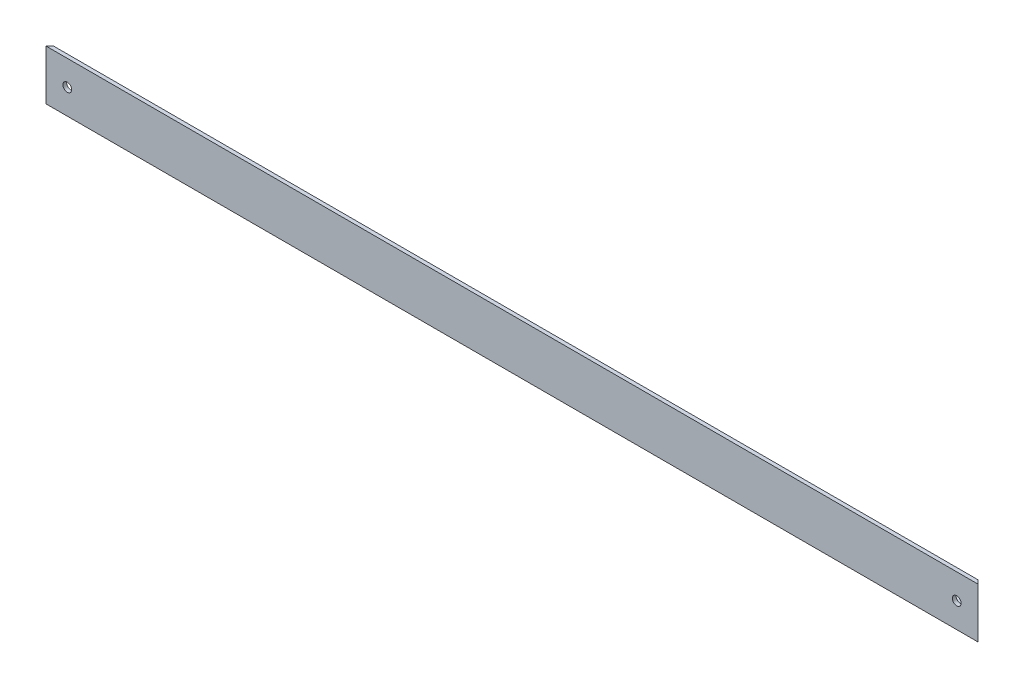
ISO-10303-21;
HEADER;
FILE_DESCRIPTION(('STEP AP214'),'2;1');
FILE_NAME('part.step','',(''),(''),'','','');
FILE_SCHEMA(('AUTOMOTIVE_DESIGN { 1 0 10303 214 1 1 1 1 }'));
ENDSEC;
DATA;
#1=APPLICATION_CONTEXT('core data for automotive mechanical design processes');
#2=APPLICATION_PROTOCOL_DEFINITION('international standard','automotive_design',2000,#1);
#3=PRODUCT_CONTEXT('',#1,'mechanical');
#4=PRODUCT('Part','Part','',(#3));
#5=PRODUCT_RELATED_PRODUCT_CATEGORY('part','',(#4));
#6=PRODUCT_DEFINITION_FORMATION('','',#4);
#7=PRODUCT_DEFINITION_CONTEXT('part definition',#1,'design');
#8=PRODUCT_DEFINITION('design','',#6,#7);
#9=PRODUCT_DEFINITION_SHAPE('','',#8);
#10=(LENGTH_UNIT() NAMED_UNIT(*) SI_UNIT(.MILLI.,.METRE.));
#11=(NAMED_UNIT(*) PLANE_ANGLE_UNIT() SI_UNIT($,.RADIAN.));
#12=(NAMED_UNIT(*) SI_UNIT($,.STERADIAN.) SOLID_ANGLE_UNIT());
#13=UNCERTAINTY_MEASURE_WITH_UNIT(LENGTH_MEASURE(1.E-05),#10,'distance_accuracy_value','');
#14=(GEOMETRIC_REPRESENTATION_CONTEXT(3) GLOBAL_UNCERTAINTY_ASSIGNED_CONTEXT((#13)) GLOBAL_UNIT_ASSIGNED_CONTEXT((#10,
#11,#12)) REPRESENTATION_CONTEXT('',''));
#15=CARTESIAN_POINT('',(0.,0.,0.));
#16=DIRECTION('',(0.,0.,1.));
#17=DIRECTION('',(1.,0.,0.));
#18=AXIS2_PLACEMENT_3D('',#15,#16,#17);
#19=CARTESIAN_POINT('',(372.,0.,0.));
#20=DIRECTION('',(0.,1.,0.));
#21=DIRECTION('',(0.,0.,1.));
#22=AXIS2_PLACEMENT_3D('',#19,#20,#21);
#23=PLANE('',#22);
#24=DIRECTION('',(0.707106781186548,0.,0.707106781186547));
#25=VECTOR('',#24,1.);
#26=CARTESIAN_POINT('',(352.,0.,-20.));
#27=LINE('',#26,#25);
#28=CARTESIAN_POINT('',(352.,0.,-20.));
#29=VERTEX_POINT('',#28);
#30=CARTESIAN_POINT('',(372.,0.,0.));
#31=VERTEX_POINT('',#30);
#32=EDGE_CURVE('E81',#29,#31,#27,.T.);
#33=ORIENTED_EDGE('',*,*,#32,.T.);
#34=DIRECTION('',(-1.,0.,0.));
#35=VECTOR('',#34,1.);
#36=CARTESIAN_POINT('',(372.,0.,0.));
#37=LINE('',#36,#35);
#38=CARTESIAN_POINT('',(0.,0.,0.));
#39=VERTEX_POINT('',#38);
#40=EDGE_CURVE('E11',#31,#39,#37,.T.);
#41=ORIENTED_EDGE('',*,*,#40,.T.);
#42=DIRECTION('',(-0.707106781186548,0.,0.707106781186547));
#43=VECTOR('',#42,1.);
#44=CARTESIAN_POINT('',(20.,0.,-20.));
#45=LINE('',#44,#43);
#46=CARTESIAN_POINT('',(20.,0.,-20.));
#47=VERTEX_POINT('',#46);
#48=EDGE_CURVE('E102',#47,#39,#45,.T.);
#49=ORIENTED_EDGE('',*,*,#48,.F.);
#50=DIRECTION('',(-1.,0.,0.));
#51=VECTOR('',#50,1.);
#52=CARTESIAN_POINT('',(372.,0.,-20.));
#53=LINE('',#52,#51);
#54=EDGE_CURVE('E43',#29,#47,#53,.T.);
#55=ORIENTED_EDGE('',*,*,#54,.F.);
#56=EDGE_LOOP('',(#33,#41,#49,#55));
#57=FACE_BOUND('',#56,.T.);
#58=ADVANCED_FACE('F34',(#57),#23,.F.);
#59=CARTESIAN_POINT('',(372.,0.,-20.));
#60=DIRECTION('',(0.,0.,1.));
#61=DIRECTION('',(1.,0.,0.));
#62=AXIS2_PLACEMENT_3D('',#59,#60,#61);
#63=PLANE('',#62);
#64=DIRECTION('',(0.,-1.,0.));
#65=VECTOR('',#64,1.);
#66=CARTESIAN_POINT('',(352.,20.,-20.));
#67=LINE('',#66,#65);
#68=CARTESIAN_POINT('',(352.,1.5,-20.));
#69=VERTEX_POINT('',#68);
#70=EDGE_CURVE('E84',#69,#29,#67,.T.);
#71=ORIENTED_EDGE('',*,*,#70,.T.);
#72=ORIENTED_EDGE('',*,*,#54,.T.);
#73=DIRECTION('',(0.,-1.,0.));
#74=VECTOR('',#73,1.);
#75=CARTESIAN_POINT('',(20.,20.,-20.));
#76=LINE('',#75,#74);
#77=CARTESIAN_POINT('',(20.,1.5,-20.));
#78=VERTEX_POINT('',#77);
#79=EDGE_CURVE('E122',#78,#47,#76,.T.);
#80=ORIENTED_EDGE('',*,*,#79,.F.);
#81=DIRECTION('',(-1.,0.,0.));
#82=VECTOR('',#81,1.);
#83=CARTESIAN_POINT('',(372.,1.5,-20.));
#84=LINE('',#83,#82);
#85=EDGE_CURVE('E98',#69,#78,#84,.T.);
#86=ORIENTED_EDGE('',*,*,#85,.F.);
#87=EDGE_LOOP('',(#71,#72,#80,#86));
#88=FACE_BOUND('',#87,.T.);
#89=ADVANCED_FACE('F95',(#88),#63,.F.);
#90=CARTESIAN_POINT('',(372.,1.5,-20.));
#91=DIRECTION('',(0.,-1.,0.));
#92=DIRECTION('',(0.,0.,-1.));
#93=AXIS2_PLACEMENT_3D('',#90,#91,#92);
#94=PLANE('',#93);
#95=DIRECTION('',(0.707106781186548,0.,0.707106781186547));
#96=VECTOR('',#95,1.);
#97=CARTESIAN_POINT('',(362.,1.5,-10.));
#98=LINE('',#97,#96);
#99=CARTESIAN_POINT('',(370.5,1.5,-1.5));
#100=VERTEX_POINT('',#99);
#101=EDGE_CURVE('E134',#69,#100,#98,.T.);
#102=ORIENTED_EDGE('',*,*,#101,.F.);
#103=ORIENTED_EDGE('',*,*,#85,.T.);
#104=DIRECTION('',(-0.707106781186548,0.,0.707106781186547));
#105=VECTOR('',#104,1.);
#106=CARTESIAN_POINT('',(196.,1.50000000000002,-196.));
#107=LINE('',#106,#105);
#108=CARTESIAN_POINT('',(1.5,1.5,-1.5));
#109=VERTEX_POINT('',#108);
#110=EDGE_CURVE('E115',#78,#109,#107,.T.);
#111=ORIENTED_EDGE('',*,*,#110,.T.);
#112=DIRECTION('',(-1.,0.,0.));
#113=VECTOR('',#112,1.);
#114=CARTESIAN_POINT('',(372.,1.5,-1.5));
#115=LINE('',#114,#113);
#116=EDGE_CURVE('E103',#100,#109,#115,.T.);
#117=ORIENTED_EDGE('',*,*,#116,.F.);
#118=EDGE_LOOP('',(#102,#103,#111,#117));
#119=FACE_BOUND('',#118,.T.);
#120=ADVANCED_FACE('F156',(#119),#94,.F.);
#121=CARTESIAN_POINT('',(372.,1.5,-1.5));
#122=DIRECTION('',(0.,0.,1.));
#123=DIRECTION('',(0.,-1.,0.));
#124=AXIS2_PLACEMENT_3D('',#121,#122,#123);
#125=PLANE('',#124);
#126=CARTESIAN_POINT('',(363.5,10.,-1.5));
#127=DIRECTION('',(0.,0.,1.));
#128=DIRECTION('',(0.,-1.,0.));
#129=AXIS2_PLACEMENT_3D('',#126,#127,#128);
#130=CIRCLE('',#129,1.75);
#131=CARTESIAN_POINT('',(363.5,8.25,-1.5));
#132=VERTEX_POINT('',#131);
#133=EDGE_CURVE('E138',#132,#132,#130,.T.);
#134=ORIENTED_EDGE('',*,*,#133,.T.);
#135=EDGE_LOOP('',(#134));
#136=FACE_BOUND('',#135,.T.);
#137=CARTESIAN_POINT('',(8.5,10.,-1.5));
#138=DIRECTION('',(0.,0.,1.));
#139=DIRECTION('',(0.,-1.,0.));
#140=AXIS2_PLACEMENT_3D('',#137,#138,#139);
#141=CIRCLE('',#140,1.75);
#142=CARTESIAN_POINT('',(8.5,8.25,-1.5));
#143=VERTEX_POINT('',#142);
#144=EDGE_CURVE('E126',#143,#143,#141,.F.);
#145=ORIENTED_EDGE('',*,*,#144,.F.);
#146=EDGE_LOOP('',(#145));
#147=FACE_BOUND('',#146,.T.);
#148=DIRECTION('',(0.,1.,0.));
#149=VECTOR('',#148,1.);
#150=CARTESIAN_POINT('',(370.5,1.5,-1.5));
#151=LINE('',#150,#149);
#152=CARTESIAN_POINT('',(370.5,20.,-1.50000000000002));
#153=VERTEX_POINT('',#152);
#154=EDGE_CURVE('E99',#100,#153,#151,.T.);
#155=ORIENTED_EDGE('',*,*,#154,.F.);
#156=ORIENTED_EDGE('',*,*,#116,.T.);
#157=DIRECTION('',(0.,1.,0.));
#158=VECTOR('',#157,1.);
#159=CARTESIAN_POINT('',(1.5,1.50000000000002,-1.5));
#160=LINE('',#159,#158);
#161=CARTESIAN_POINT('',(1.5,20.,-1.5));
#162=VERTEX_POINT('',#161);
#163=EDGE_CURVE('E119',#109,#162,#160,.T.);
#164=ORIENTED_EDGE('',*,*,#163,.T.);
#165=DIRECTION('',(-1.,0.,0.));
#166=VECTOR('',#165,1.);
#167=CARTESIAN_POINT('',(372.,20.,-1.5));
#168=LINE('',#167,#166);
#169=EDGE_CURVE('E107',#153,#162,#168,.T.);
#170=ORIENTED_EDGE('',*,*,#169,.F.);
#171=EDGE_LOOP('',(#155,#156,#164,#170));
#172=FACE_BOUND('',#171,.T.);
#173=ADVANCED_FACE('F152',(#136,#147,#172),#125,.F.);
#174=CARTESIAN_POINT('',(372.,20.,-1.5));
#175=DIRECTION('',(0.,-1.,0.));
#176=DIRECTION('',(0.,0.,-1.));
#177=AXIS2_PLACEMENT_3D('',#174,#175,#176);
#178=PLANE('',#177);
#179=DIRECTION('',(0.707106781186548,0.,0.707106781186547));
#180=VECTOR('',#179,1.);
#181=CARTESIAN_POINT('',(352.,20.,-20.));
#182=LINE('',#181,#180);
#183=CARTESIAN_POINT('',(372.,20.,0.));
#184=VERTEX_POINT('',#183);
#185=EDGE_CURVE('E49',#153,#184,#182,.T.);
#186=ORIENTED_EDGE('',*,*,#185,.F.);
#187=ORIENTED_EDGE('',*,*,#169,.T.);
#188=DIRECTION('',(-0.707106781186548,0.,0.707106781186547));
#189=VECTOR('',#188,1.);
#190=CARTESIAN_POINT('',(20.,20.,-20.));
#191=LINE('',#190,#189);
#192=CARTESIAN_POINT('',(0.,20.,0.));
#193=VERTEX_POINT('',#192);
#194=EDGE_CURVE('E124',#162,#193,#191,.T.);
#195=ORIENTED_EDGE('',*,*,#194,.T.);
#196=DIRECTION('',(-1.,0.,0.));
#197=VECTOR('',#196,1.);
#198=CARTESIAN_POINT('',(372.,20.,0.));
#199=LINE('',#198,#197);
#200=EDGE_CURVE('E109',#184,#193,#199,.T.);
#201=ORIENTED_EDGE('',*,*,#200,.F.);
#202=EDGE_LOOP('',(#186,#187,#195,#201));
#203=FACE_BOUND('',#202,.T.);
#204=ADVANCED_FACE('F155',(#203),#178,.F.);
#205=CARTESIAN_POINT('',(372.,20.,0.));
#206=DIRECTION('',(0.,0.,-1.));
#207=DIRECTION('',(-1.,0.,0.));
#208=AXIS2_PLACEMENT_3D('',#205,#206,#207);
#209=PLANE('',#208);
#210=CARTESIAN_POINT('',(363.5,10.,0.));
#211=DIRECTION('',(0.,0.,-1.));
#212=DIRECTION('',(-1.,0.,0.));
#213=AXIS2_PLACEMENT_3D('',#210,#211,#212);
#214=CIRCLE('',#213,1.75);
#215=CARTESIAN_POINT('',(361.75,10.,0.));
#216=VERTEX_POINT('',#215);
#217=EDGE_CURVE('E91',#216,#216,#214,.T.);
#218=ORIENTED_EDGE('',*,*,#217,.T.);
#219=EDGE_LOOP('',(#218));
#220=FACE_BOUND('',#219,.T.);
#221=CARTESIAN_POINT('',(8.5,10.,0.));
#222=DIRECTION('',(0.,0.,1.));
#223=DIRECTION('',(1.,0.,0.));
#224=AXIS2_PLACEMENT_3D('',#221,#222,#223);
#225=CIRCLE('',#224,1.75);
#226=CARTESIAN_POINT('',(10.25,10.,0.));
#227=VERTEX_POINT('',#226);
#228=EDGE_CURVE('E131',#227,#227,#225,.T.);
#229=ORIENTED_EDGE('',*,*,#228,.F.);
#230=EDGE_LOOP('',(#229));
#231=FACE_BOUND('',#230,.T.);
#232=DIRECTION('',(0.,-1.,0.));
#233=VECTOR('',#232,1.);
#234=CARTESIAN_POINT('',(0.,20.,0.));
#235=LINE('',#234,#233);
#236=EDGE_CURVE('E112',#193,#39,#235,.T.);
#237=ORIENTED_EDGE('',*,*,#236,.T.);
#238=ORIENTED_EDGE('',*,*,#40,.F.);
#239=DIRECTION('',(0.,-1.,0.));
#240=VECTOR('',#239,1.);
#241=CARTESIAN_POINT('',(372.,20.,0.));
#242=LINE('',#241,#240);
#243=EDGE_CURVE('E87',#184,#31,#242,.T.);
#244=ORIENTED_EDGE('',*,*,#243,.F.);
#245=ORIENTED_EDGE('',*,*,#200,.T.);
#246=EDGE_LOOP('',(#237,#238,#244,#245));
#247=FACE_BOUND('',#246,.T.);
#248=ADVANCED_FACE('F36',(#220,#231,#247),#209,.F.);
#249=CARTESIAN_POINT('',(20.,20.,-20.));
#250=DIRECTION('',(0.707106781186547,0.,0.707106781186548));
#251=DIRECTION('',(0.707106781186548,0.,-0.707106781186547));
#252=AXIS2_PLACEMENT_3D('',#249,#250,#251);
#253=PLANE('',#252);
#254=ORIENTED_EDGE('',*,*,#79,.T.);
#255=ORIENTED_EDGE('',*,*,#48,.T.);
#256=ORIENTED_EDGE('',*,*,#236,.F.);
#257=ORIENTED_EDGE('',*,*,#194,.F.);
#258=ORIENTED_EDGE('',*,*,#163,.F.);
#259=ORIENTED_EDGE('',*,*,#110,.F.);
#260=EDGE_LOOP('',(#254,#255,#256,#257,#258,#259));
#261=FACE_BOUND('',#260,.T.);
#262=ADVANCED_FACE('F167',(#261),#253,.F.);
#263=CARTESIAN_POINT('',(8.5,10.,-20.001));
#264=DIRECTION('',(0.,0.,1.));
#265=DIRECTION('',(1.,0.,0.));
#266=AXIS2_PLACEMENT_3D('',#263,#264,#265);
#267=CYLINDRICAL_SURFACE('',#266,1.75);
#268=ORIENTED_EDGE('',*,*,#228,.T.);
#269=EDGE_LOOP('',(#268));
#270=FACE_BOUND('',#269,.T.);
#271=ORIENTED_EDGE('',*,*,#144,.T.);
#272=EDGE_LOOP('',(#271));
#273=FACE_BOUND('',#272,.T.);
#274=ADVANCED_FACE('F176',(#270,#273),#267,.F.);
#275=CARTESIAN_POINT('',(352.,20.,-20.));
#276=DIRECTION('',(0.707106781186547,0.,-0.707106781186548));
#277=DIRECTION('',(-0.707106781186548,0.,-0.707106781186547));
#278=AXIS2_PLACEMENT_3D('',#275,#276,#277);
#279=PLANE('',#278);
#280=ORIENTED_EDGE('',*,*,#101,.T.);
#281=ORIENTED_EDGE('',*,*,#154,.T.);
#282=ORIENTED_EDGE('',*,*,#185,.T.);
#283=ORIENTED_EDGE('',*,*,#243,.T.);
#284=ORIENTED_EDGE('',*,*,#32,.F.);
#285=ORIENTED_EDGE('',*,*,#70,.F.);
#286=EDGE_LOOP('',(#280,#281,#282,#283,#284,#285));
#287=FACE_BOUND('',#286,.T.);
#288=ADVANCED_FACE('F83',(#287),#279,.T.);
#289=CARTESIAN_POINT('',(363.5,10.,-20.001));
#290=DIRECTION('',(0.,0.,1.));
#291=DIRECTION('',(1.,0.,0.));
#292=AXIS2_PLACEMENT_3D('',#289,#290,#291);
#293=CYLINDRICAL_SURFACE('',#292,1.75);
#294=ORIENTED_EDGE('',*,*,#217,.F.);
#295=EDGE_LOOP('',(#294));
#296=FACE_BOUND('',#295,.T.);
#297=ORIENTED_EDGE('',*,*,#133,.F.);
#298=EDGE_LOOP('',(#297));
#299=FACE_BOUND('',#298,.T.);
#300=ADVANCED_FACE('F146',(#296,#299),#293,.F.);
#301=CLOSED_SHELL('',(#58,#89,#120,#173,#204,#248,#262,#274,#288,#300));
#302=MANIFOLD_SOLID_BREP('B2',#301);
#303=ADVANCED_BREP_SHAPE_REPRESENTATION('',(#18,#302),#14);
#304=SHAPE_DEFINITION_REPRESENTATION(#9,#303);
ENDSEC;
END-ISO-10303-21;
